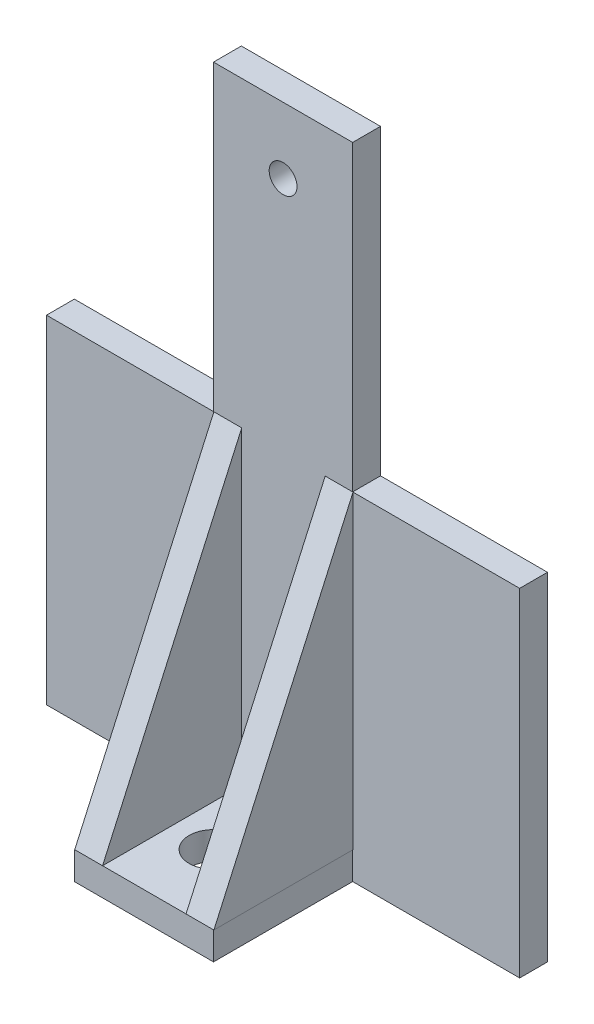
ISO-10303-21;
HEADER;
FILE_DESCRIPTION(('STEP AP214'),'2;1');
FILE_NAME('part.step','',(''),(''),'','','');
FILE_SCHEMA(('AUTOMOTIVE_DESIGN { 1 0 10303 214 1 1 1 1 }'));
ENDSEC;
DATA;
#1=APPLICATION_CONTEXT('core data for automotive mechanical design processes');
#2=APPLICATION_PROTOCOL_DEFINITION('international standard','automotive_design',2000,#1);
#3=PRODUCT_CONTEXT('',#1,'mechanical');
#4=PRODUCT('Part','Part','',(#3));
#5=PRODUCT_RELATED_PRODUCT_CATEGORY('part','',(#4));
#6=PRODUCT_DEFINITION_FORMATION('','',#4);
#7=PRODUCT_DEFINITION_CONTEXT('part definition',#1,'design');
#8=PRODUCT_DEFINITION('design','',#6,#7);
#9=PRODUCT_DEFINITION_SHAPE('','',#8);
#10=(LENGTH_UNIT() NAMED_UNIT(*) SI_UNIT(.MILLI.,.METRE.));
#11=(NAMED_UNIT(*) PLANE_ANGLE_UNIT() SI_UNIT($,.RADIAN.));
#12=(NAMED_UNIT(*) SI_UNIT($,.STERADIAN.) SOLID_ANGLE_UNIT());
#13=UNCERTAINTY_MEASURE_WITH_UNIT(LENGTH_MEASURE(1.E-05),#10,'distance_accuracy_value','');
#14=(GEOMETRIC_REPRESENTATION_CONTEXT(3) GLOBAL_UNCERTAINTY_ASSIGNED_CONTEXT((#13)) GLOBAL_UNIT_ASSIGNED_CONTEXT((#10,
#11,#12)) REPRESENTATION_CONTEXT('',''));
#15=CARTESIAN_POINT('',(0.,0.,0.));
#16=DIRECTION('',(0.,0.,1.));
#17=DIRECTION('',(1.,0.,0.));
#18=AXIS2_PLACEMENT_3D('',#15,#16,#17);
#19=CARTESIAN_POINT('',(4.60182672335277,-6.70833333333333,12.));
#20=DIRECTION('',(0.,0.409938501027306,0.912113164785755));
#21=DIRECTION('',(0.,-0.912113164785755,0.409938501027306));
#22=AXIS2_PLACEMENT_3D('',#19,#20,#21);
#23=PLANE('',#22);
#24=DIRECTION('',(0.,-0.912113164785755,0.409938501027306));
#25=VECTOR('',#24,1.);
#26=CARTESIAN_POINT('',(-3.39817327664723,-6.70833333333333,12.));
#27=LINE('',#26,#25);
#28=CARTESIAN_POINT('',(-3.39817327664723,15.5416666666667,2.));
#29=VERTEX_POINT('',#28);
#30=CARTESIAN_POINT('',(-3.39817327664723,-6.70833333333333,12.));
#31=VERTEX_POINT('',#30);
#32=EDGE_CURVE('E11',#29,#31,#27,.T.);
#33=ORIENTED_EDGE('',*,*,#32,.F.);
#34=DIRECTION('',(-1.,0.,0.));
#35=VECTOR('',#34,1.);
#36=CARTESIAN_POINT('',(4.60182672335277,15.5416666666667,2.));
#37=LINE('',#36,#35);
#38=CARTESIAN_POINT('',(-5.39817327664723,15.5416666666667,2.));
#39=VERTEX_POINT('',#38);
#40=EDGE_CURVE('E181',#29,#39,#37,.T.);
#41=ORIENTED_EDGE('',*,*,#40,.T.);
#42=DIRECTION('',(0.,0.912113164785755,-0.409938501027306));
#43=VECTOR('',#42,1.);
#44=CARTESIAN_POINT('',(-5.39817327664723,-6.70833333333333,12.));
#45=LINE('',#44,#43);
#46=CARTESIAN_POINT('',(-5.39817327664723,-6.70833333333333,12.));
#47=VERTEX_POINT('',#46);
#48=EDGE_CURVE('E198',#47,#39,#45,.T.);
#49=ORIENTED_EDGE('',*,*,#48,.F.);
#50=DIRECTION('',(-1.,0.,0.));
#51=VECTOR('',#50,1.);
#52=CARTESIAN_POINT('',(-17.425350174075,-6.70833333333333,12.));
#53=LINE('',#52,#51);
#54=EDGE_CURVE('E260',#31,#47,#53,.T.);
#55=ORIENTED_EDGE('',*,*,#54,.F.);
#56=EDGE_LOOP('',(#33,#41,#49,#55));
#57=FACE_BOUND('',#56,.T.);
#58=ADVANCED_FACE('F41',(#57),#23,.T.);
#59=CARTESIAN_POINT('',(0.,0.,2.));
#60=DIRECTION('',(0.,0.,1.));
#61=DIRECTION('',(1.,0.,0.));
#62=AXIS2_PLACEMENT_3D('',#59,#60,#61);
#63=PLANE('',#62);
#64=DIRECTION('',(-1.,0.,0.));
#65=VECTOR('',#64,1.);
#66=CARTESIAN_POINT('',(4.60182672335277,-6.70833333333333,2.));
#67=LINE('',#66,#65);
#68=CARTESIAN_POINT('',(4.60182672335277,-6.70833333333333,2.));
#69=VERTEX_POINT('',#68);
#70=CARTESIAN_POINT('',(4.57464982592503,-6.70833333333333,2.));
#71=VERTEX_POINT('',#70);
#72=EDGE_CURVE('E210',#69,#71,#67,.T.);
#73=ORIENTED_EDGE('',*,*,#72,.T.);
#74=DIRECTION('',(0.,1.,0.));
#75=VECTOR('',#74,1.);
#76=CARTESIAN_POINT('',(4.57464982592503,-16.7083333333333,2.));
#77=LINE('',#76,#75);
#78=CARTESIAN_POINT('',(4.57464982592503,-8.70833333333333,2.));
#79=VERTEX_POINT('',#78);
#80=EDGE_CURVE('E232',#79,#71,#77,.T.);
#81=ORIENTED_EDGE('',*,*,#80,.F.);
#82=DIRECTION('',(-1.,0.,0.));
#83=VECTOR('',#82,1.);
#84=CARTESIAN_POINT('',(0.,-8.70833333333333,2.));
#85=LINE('',#84,#83);
#86=CARTESIAN_POINT('',(16.574649825925,-8.70833333333333,2.));
#87=VERTEX_POINT('',#86);
#88=EDGE_CURVE('E244',#87,#79,#85,.T.);
#89=ORIENTED_EDGE('',*,*,#88,.F.);
#90=DIRECTION('',(0.,1.,0.));
#91=VECTOR('',#90,1.);
#92=CARTESIAN_POINT('',(16.574649825925,0.,2.));
#93=LINE('',#92,#91);
#94=CARTESIAN_POINT('',(16.574649825925,15.5416666666667,2.));
#95=VERTEX_POINT('',#94);
#96=EDGE_CURVE('E278',#87,#95,#93,.T.);
#97=ORIENTED_EDGE('',*,*,#96,.T.);
#98=DIRECTION('',(1.,0.,0.));
#99=VECTOR('',#98,1.);
#100=CARTESIAN_POINT('',(0.,15.5416666666667,2.));
#101=LINE('',#100,#99);
#102=CARTESIAN_POINT('',(4.60182672335277,15.5416666666667,2.));
#103=VERTEX_POINT('',#102);
#104=EDGE_CURVE('E282',#103,#95,#101,.T.);
#105=ORIENTED_EDGE('',*,*,#104,.F.);
#106=DIRECTION('',(0.,-1.,0.));
#107=VECTOR('',#106,1.);
#108=CARTESIAN_POINT('',(4.60182672335277,15.5416666666667,2.));
#109=LINE('',#108,#107);
#110=EDGE_CURVE('E201',#103,#69,#109,.T.);
#111=ORIENTED_EDGE('',*,*,#110,.T.);
#112=EDGE_LOOP('',(#73,#81,#89,#97,#105,#111));
#113=FACE_BOUND('',#112,.T.);
#114=ADVANCED_FACE('F414',(#113),#63,.T.);
#115=CARTESIAN_POINT('',(0.,15.5416666666667,2.));
#116=DIRECTION('',(0.,1.,0.));
#117=DIRECTION('',(0.,0.,1.));
#118=AXIS2_PLACEMENT_3D('',#115,#116,#117);
#119=PLANE('',#118);
#120=DIRECTION('',(1.,0.,0.));
#121=VECTOR('',#120,1.);
#122=CARTESIAN_POINT('',(0.,15.5416666666667,0.));
#123=LINE('',#122,#121);
#124=CARTESIAN_POINT('',(-17.425350174075,15.5416666666667,0.));
#125=VERTEX_POINT('',#124);
#126=CARTESIAN_POINT('',(-5.42535017407497,15.5416666666667,0.));
#127=VERTEX_POINT('',#126);
#128=EDGE_CURVE('E306',#125,#127,#123,.T.);
#129=ORIENTED_EDGE('',*,*,#128,.F.);
#130=DIRECTION('',(0.,0.,-1.));
#131=VECTOR('',#130,1.);
#132=CARTESIAN_POINT('',(-17.425350174075,15.5416666666667,2.));
#133=LINE('',#132,#131);
#134=CARTESIAN_POINT('',(-17.425350174075,15.5416666666667,2.));
#135=VERTEX_POINT('',#134);
#136=EDGE_CURVE('E357',#135,#125,#133,.T.);
#137=ORIENTED_EDGE('',*,*,#136,.F.);
#138=DIRECTION('',(1.,0.,0.));
#139=VECTOR('',#138,1.);
#140=CARTESIAN_POINT('',(0.,15.5416666666667,2.));
#141=LINE('',#140,#139);
#142=CARTESIAN_POINT('',(-5.42535017407497,15.5416666666667,2.));
#143=VERTEX_POINT('',#142);
#144=EDGE_CURVE('E270',#135,#143,#141,.T.);
#145=ORIENTED_EDGE('',*,*,#144,.T.);
#146=DIRECTION('',(0.,0.,-1.));
#147=VECTOR('',#146,1.);
#148=CARTESIAN_POINT('',(-5.42535017407497,15.5416666666667,2.));
#149=LINE('',#148,#147);
#150=EDGE_CURVE('E298',#143,#127,#149,.T.);
#151=ORIENTED_EDGE('',*,*,#150,.T.);
#152=EDGE_LOOP('',(#129,#137,#145,#151));
#153=FACE_BOUND('',#152,.T.);
#154=ADVANCED_FACE('F395',(#153),#119,.T.);
#155=CARTESIAN_POINT('',(-17.425350174075,0.,2.));
#156=DIRECTION('',(-1.,0.,0.));
#157=DIRECTION('',(0.,0.,1.));
#158=AXIS2_PLACEMENT_3D('',#155,#156,#157);
#159=PLANE('',#158);
#160=DIRECTION('',(0.,0.,-1.));
#161=VECTOR('',#160,1.);
#162=CARTESIAN_POINT('',(-17.425350174075,-8.70833333333333,2.));
#163=LINE('',#162,#161);
#164=CARTESIAN_POINT('',(-17.425350174075,-8.70833333333333,2.));
#165=VERTEX_POINT('',#164);
#166=CARTESIAN_POINT('',(-17.425350174075,-8.70833333333333,0.));
#167=VERTEX_POINT('',#166);
#168=EDGE_CURVE('E354',#165,#167,#163,.T.);
#169=ORIENTED_EDGE('',*,*,#168,.F.);
#170=DIRECTION('',(0.,1.,0.));
#171=VECTOR('',#170,1.);
#172=CARTESIAN_POINT('',(-17.425350174075,0.,2.));
#173=LINE('',#172,#171);
#174=EDGE_CURVE('E275',#165,#135,#173,.T.);
#175=ORIENTED_EDGE('',*,*,#174,.T.);
#176=ORIENTED_EDGE('',*,*,#136,.T.);
#177=DIRECTION('',(0.,1.,0.));
#178=VECTOR('',#177,1.);
#179=CARTESIAN_POINT('',(-17.425350174075,0.,0.));
#180=LINE('',#179,#178);
#181=EDGE_CURVE('E310',#167,#125,#180,.T.);
#182=ORIENTED_EDGE('',*,*,#181,.F.);
#183=EDGE_LOOP('',(#169,#175,#176,#182));
#184=FACE_BOUND('',#183,.T.);
#185=ADVANCED_FACE('F403',(#184),#159,.T.);
#186=CARTESIAN_POINT('',(0.,-8.70833333333333,2.));
#187=DIRECTION('',(0.,1.,0.));
#188=DIRECTION('',(0.,0.,1.));
#189=AXIS2_PLACEMENT_3D('',#186,#187,#188);
#190=PLANE('',#189);
#191=CARTESIAN_POINT('',(-0.425350174074971,-8.70833333333333,7.));
#192=DIRECTION('',(0.,1.,0.));
#193=DIRECTION('',(0.,0.,1.));
#194=AXIS2_PLACEMENT_3D('',#191,#192,#193);
#195=CIRCLE('',#194,1.75);
#196=CARTESIAN_POINT('',(-0.425350174074971,-8.70833333333333,8.75));
#197=VERTEX_POINT('',#196);
#198=EDGE_CURVE('E252',#197,#197,#195,.T.);
#199=ORIENTED_EDGE('',*,*,#198,.T.);
#200=EDGE_LOOP('',(#199));
#201=FACE_BOUND('',#200,.T.);
#202=DIRECTION('',(0.,0.,-1.));
#203=VECTOR('',#202,1.);
#204=CARTESIAN_POINT('',(-5.39817327664723,-8.70833333333333,2.));
#205=LINE('',#204,#203);
#206=CARTESIAN_POINT('',(-5.39817327664723,-8.70833333333333,12.));
#207=VERTEX_POINT('',#206);
#208=CARTESIAN_POINT('',(-5.39817327664723,-8.70833333333333,2.));
#209=VERTEX_POINT('',#208);
#210=EDGE_CURVE('E64',#207,#209,#205,.T.);
#211=ORIENTED_EDGE('',*,*,#210,.T.);
#212=DIRECTION('',(-1.,0.,0.));
#213=VECTOR('',#212,1.);
#214=CARTESIAN_POINT('',(0.,-8.70833333333333,2.));
#215=LINE('',#214,#213);
#216=EDGE_CURVE('E248',#209,#165,#215,.T.);
#217=ORIENTED_EDGE('',*,*,#216,.T.);
#218=ORIENTED_EDGE('',*,*,#168,.T.);
#219=DIRECTION('',(1.,0.,0.));
#220=VECTOR('',#219,1.);
#221=CARTESIAN_POINT('',(0.,-8.70833333333333,0.));
#222=LINE('',#221,#220);
#223=CARTESIAN_POINT('',(16.574649825925,-8.70833333333333,0.));
#224=VERTEX_POINT('',#223);
#225=EDGE_CURVE('E314',#167,#224,#222,.T.);
#226=ORIENTED_EDGE('',*,*,#225,.T.);
#227=DIRECTION('',(0.,0.,-1.));
#228=VECTOR('',#227,1.);
#229=CARTESIAN_POINT('',(16.574649825925,-8.70833333333333,2.));
#230=LINE('',#229,#228);
#231=EDGE_CURVE('E351',#87,#224,#230,.T.);
#232=ORIENTED_EDGE('',*,*,#231,.F.);
#233=ORIENTED_EDGE('',*,*,#88,.T.);
#234=DIRECTION('',(0.,0.,1.));
#235=VECTOR('',#234,1.);
#236=CARTESIAN_POINT('',(4.57464982592503,-8.70833333333333,2.));
#237=LINE('',#236,#235);
#238=CARTESIAN_POINT('',(4.57464982592503,-8.70833333333333,12.));
#239=VERTEX_POINT('',#238);
#240=EDGE_CURVE('E231',#79,#239,#237,.T.);
#241=ORIENTED_EDGE('',*,*,#240,.T.);
#242=DIRECTION('',(1.,0.,0.));
#243=VECTOR('',#242,1.);
#244=CARTESIAN_POINT('',(-17.425350174075,-8.70833333333333,12.));
#245=LINE('',#244,#243);
#246=EDGE_CURVE('E256',#207,#239,#245,.T.);
#247=ORIENTED_EDGE('',*,*,#246,.F.);
#248=EDGE_LOOP('',(#211,#217,#218,#226,#232,#233,#241,#247));
#249=FACE_BOUND('',#248,.T.);
#250=ADVANCED_FACE('F399',(#201,#249),#190,.F.);
#251=CARTESIAN_POINT('',(16.574649825925,0.,2.));
#252=DIRECTION('',(-1.,0.,0.));
#253=DIRECTION('',(0.,0.,1.));
#254=AXIS2_PLACEMENT_3D('',#251,#252,#253);
#255=PLANE('',#254);
#256=ORIENTED_EDGE('',*,*,#96,.F.);
#257=ORIENTED_EDGE('',*,*,#231,.T.);
#258=DIRECTION('',(0.,1.,0.));
#259=VECTOR('',#258,1.);
#260=CARTESIAN_POINT('',(16.574649825925,0.,0.));
#261=LINE('',#260,#259);
#262=CARTESIAN_POINT('',(16.574649825925,15.5416666666667,0.));
#263=VERTEX_POINT('',#262);
#264=EDGE_CURVE('E318',#224,#263,#261,.T.);
#265=ORIENTED_EDGE('',*,*,#264,.T.);
#266=DIRECTION('',(0.,0.,-1.));
#267=VECTOR('',#266,1.);
#268=CARTESIAN_POINT('',(16.574649825925,15.5416666666667,2.));
#269=LINE('',#268,#267);
#270=EDGE_CURVE('E348',#95,#263,#269,.T.);
#271=ORIENTED_EDGE('',*,*,#270,.F.);
#272=EDGE_LOOP('',(#256,#257,#265,#271));
#273=FACE_BOUND('',#272,.T.);
#274=ADVANCED_FACE('F410',(#273),#255,.F.);
#275=CARTESIAN_POINT('',(0.,15.5416666666667,2.));
#276=DIRECTION('',(0.,1.,0.));
#277=DIRECTION('',(0.,0.,1.));
#278=AXIS2_PLACEMENT_3D('',#275,#276,#277);
#279=PLANE('',#278);
#280=DIRECTION('',(1.,0.,0.));
#281=VECTOR('',#280,1.);
#282=CARTESIAN_POINT('',(0.,15.5416666666667,0.));
#283=LINE('',#282,#281);
#284=CARTESIAN_POINT('',(4.57464982592503,15.5416666666667,0.));
#285=VERTEX_POINT('',#284);
#286=EDGE_CURVE('E322',#285,#263,#283,.T.);
#287=ORIENTED_EDGE('',*,*,#286,.F.);
#288=DIRECTION('',(0.,0.,-1.));
#289=VECTOR('',#288,1.);
#290=CARTESIAN_POINT('',(4.57464982592503,15.5416666666667,2.));
#291=LINE('',#290,#289);
#292=CARTESIAN_POINT('',(4.57464982592503,15.5416666666667,2.));
#293=VERTEX_POINT('',#292);
#294=EDGE_CURVE('E345',#293,#285,#291,.T.);
#295=ORIENTED_EDGE('',*,*,#294,.F.);
#296=EDGE_CURVE('E283',#293,#103,#101,.T.);
#297=ORIENTED_EDGE('',*,*,#296,.T.);
#298=ORIENTED_EDGE('',*,*,#104,.T.);
#299=ORIENTED_EDGE('',*,*,#270,.T.);
#300=EDGE_LOOP('',(#287,#295,#297,#298,#299));
#301=FACE_BOUND('',#300,.T.);
#302=ADVANCED_FACE('F377',(#301),#279,.T.);
#303=CARTESIAN_POINT('',(4.57464982592503,0.,2.));
#304=DIRECTION('',(-1.,0.,0.));
#305=DIRECTION('',(0.,0.,1.));
#306=AXIS2_PLACEMENT_3D('',#303,#304,#305);
#307=PLANE('',#306);
#308=DIRECTION('',(0.,1.,0.));
#309=VECTOR('',#308,1.);
#310=CARTESIAN_POINT('',(4.57464982592503,0.,0.));
#311=LINE('',#310,#309);
#312=CARTESIAN_POINT('',(4.57464982592503,37.2916666666667,0.));
#313=VERTEX_POINT('',#312);
#314=EDGE_CURVE('E326',#285,#313,#311,.T.);
#315=ORIENTED_EDGE('',*,*,#314,.T.);
#316=DIRECTION('',(0.,0.,-1.));
#317=VECTOR('',#316,1.);
#318=CARTESIAN_POINT('',(4.57464982592503,37.2916666666667,2.));
#319=LINE('',#318,#317);
#320=CARTESIAN_POINT('',(4.57464982592503,37.2916666666667,2.));
#321=VERTEX_POINT('',#320);
#322=EDGE_CURVE('E342',#321,#313,#319,.T.);
#323=ORIENTED_EDGE('',*,*,#322,.F.);
#324=DIRECTION('',(0.,1.,0.));
#325=VECTOR('',#324,1.);
#326=CARTESIAN_POINT('',(4.57464982592503,0.,2.));
#327=LINE('',#326,#325);
#328=EDGE_CURVE('E287',#293,#321,#327,.T.);
#329=ORIENTED_EDGE('',*,*,#328,.F.);
#330=ORIENTED_EDGE('',*,*,#294,.T.);
#331=EDGE_LOOP('',(#315,#323,#329,#330));
#332=FACE_BOUND('',#331,.T.);
#333=ADVANCED_FACE('F383',(#332),#307,.F.);
#334=CARTESIAN_POINT('',(0.,37.2916666666667,2.));
#335=DIRECTION('',(0.,1.,0.));
#336=DIRECTION('',(0.,0.,1.));
#337=AXIS2_PLACEMENT_3D('',#334,#335,#336);
#338=PLANE('',#337);
#339=DIRECTION('',(1.,0.,0.));
#340=VECTOR('',#339,1.);
#341=CARTESIAN_POINT('',(0.,37.2916666666667,0.));
#342=LINE('',#341,#340);
#343=CARTESIAN_POINT('',(-5.42535017407497,37.2916666666667,0.));
#344=VERTEX_POINT('',#343);
#345=EDGE_CURVE('E330',#344,#313,#342,.T.);
#346=ORIENTED_EDGE('',*,*,#345,.F.);
#347=DIRECTION('',(0.,0.,-1.));
#348=VECTOR('',#347,1.);
#349=CARTESIAN_POINT('',(-5.42535017407497,37.2916666666667,2.));
#350=LINE('',#349,#348);
#351=CARTESIAN_POINT('',(-5.42535017407497,37.2916666666667,2.));
#352=VERTEX_POINT('',#351);
#353=EDGE_CURVE('E339',#352,#344,#350,.T.);
#354=ORIENTED_EDGE('',*,*,#353,.F.);
#355=DIRECTION('',(1.,0.,0.));
#356=VECTOR('',#355,1.);
#357=CARTESIAN_POINT('',(0.,37.2916666666667,2.));
#358=LINE('',#357,#356);
#359=EDGE_CURVE('E290',#352,#321,#358,.T.);
#360=ORIENTED_EDGE('',*,*,#359,.T.);
#361=ORIENTED_EDGE('',*,*,#322,.T.);
#362=EDGE_LOOP('',(#346,#354,#360,#361));
#363=FACE_BOUND('',#362,.T.);
#364=ADVANCED_FACE('F464',(#363),#338,.T.);
#365=CARTESIAN_POINT('',(-0.425350174074971,-3.95833333333333,2.));
#366=DIRECTION('',(0.,0.,-1.));
#367=DIRECTION('',(-1.,0.,0.));
#368=AXIS2_PLACEMENT_3D('',#365,#366,#367);
#369=CYLINDRICAL_SURFACE('',#368,1.);
#370=CARTESIAN_POINT('',(-0.425350174074971,-3.95833333333333,2.));
#371=DIRECTION('',(0.,0.,-1.));
#372=DIRECTION('',(-1.,0.,0.));
#373=AXIS2_PLACEMENT_3D('',#370,#371,#372);
#374=CIRCLE('',#373,1.);
#375=CARTESIAN_POINT('',(-1.42535017407497,-3.95833333333333,2.));
#376=VERTEX_POINT('',#375);
#377=EDGE_CURVE('E191',#376,#376,#374,.T.);
#378=ORIENTED_EDGE('',*,*,#377,.F.);
#379=EDGE_LOOP('',(#378));
#380=FACE_BOUND('',#379,.T.);
#381=CARTESIAN_POINT('',(-0.425350174074971,-3.95833333333333,0.));
#382=DIRECTION('',(0.,0.,1.));
#383=DIRECTION('',(1.,0.,0.));
#384=AXIS2_PLACEMENT_3D('',#381,#382,#383);
#385=CIRCLE('',#384,1.);
#386=CARTESIAN_POINT('',(0.574649825925029,-3.95833333333333,0.));
#387=VERTEX_POINT('',#386);
#388=EDGE_CURVE('E302',#387,#387,#385,.T.);
#389=ORIENTED_EDGE('',*,*,#388,.F.);
#390=EDGE_LOOP('',(#389));
#391=FACE_BOUND('',#390,.T.);
#392=ADVANCED_FACE('F467',(#380,#391),#369,.F.);
#393=CARTESIAN_POINT('',(-0.425350174074971,32.5416666666667,2.));
#394=DIRECTION('',(0.,0.,-1.));
#395=DIRECTION('',(-1.,0.,0.));
#396=AXIS2_PLACEMENT_3D('',#393,#394,#395);
#397=CYLINDRICAL_SURFACE('',#396,1.);
#398=CARTESIAN_POINT('',(-0.425350174074971,32.5416666666667,2.));
#399=DIRECTION('',(0.,0.,1.));
#400=DIRECTION('',(1.,0.,0.));
#401=AXIS2_PLACEMENT_3D('',#398,#399,#400);
#402=CIRCLE('',#401,1.);
#403=CARTESIAN_POINT('',(0.574649825925029,32.5416666666667,2.));
#404=VERTEX_POINT('',#403);
#405=EDGE_CURVE('E266',#404,#404,#402,.T.);
#406=ORIENTED_EDGE('',*,*,#405,.T.);
#407=EDGE_LOOP('',(#406));
#408=FACE_BOUND('',#407,.T.);
#409=CARTESIAN_POINT('',(-0.425350174074971,32.5416666666667,0.));
#410=DIRECTION('',(0.,0.,1.));
#411=DIRECTION('',(1.,0.,0.));
#412=AXIS2_PLACEMENT_3D('',#409,#410,#411);
#413=CIRCLE('',#412,1.);
#414=CARTESIAN_POINT('',(0.574649825925029,32.5416666666667,0.));
#415=VERTEX_POINT('',#414);
#416=EDGE_CURVE('E265',#415,#415,#413,.T.);
#417=ORIENTED_EDGE('',*,*,#416,.F.);
#418=EDGE_LOOP('',(#417));
#419=FACE_BOUND('',#418,.T.);
#420=ADVANCED_FACE('F43',(#408,#419),#397,.F.);
#421=CARTESIAN_POINT('',(-5.42535017407497,0.,2.));
#422=DIRECTION('',(-1.,0.,0.));
#423=DIRECTION('',(0.,-1.,0.));
#424=AXIS2_PLACEMENT_3D('',#421,#422,#423);
#425=PLANE('',#424);
#426=DIRECTION('',(0.,1.,0.));
#427=VECTOR('',#426,1.);
#428=CARTESIAN_POINT('',(-5.42535017407497,0.,0.));
#429=LINE('',#428,#427);
#430=EDGE_CURVE('E271',#127,#344,#429,.T.);
#431=ORIENTED_EDGE('',*,*,#430,.F.);
#432=ORIENTED_EDGE('',*,*,#150,.F.);
#433=DIRECTION('',(0.,1.,0.));
#434=VECTOR('',#433,1.);
#435=CARTESIAN_POINT('',(-5.42535017407497,0.,2.));
#436=LINE('',#435,#434);
#437=EDGE_CURVE('E294',#143,#352,#436,.T.);
#438=ORIENTED_EDGE('',*,*,#437,.T.);
#439=ORIENTED_EDGE('',*,*,#353,.T.);
#440=EDGE_LOOP('',(#431,#432,#438,#439));
#441=FACE_BOUND('',#440,.T.);
#442=ADVANCED_FACE('F390',(#441),#425,.T.);
#443=CARTESIAN_POINT('',(2.60182672335277,15.5416666666667,2.));
#444=VERTEX_POINT('',#443);
#445=EDGE_CURVE('E215',#293,#444,#37,.T.);
#446=ORIENTED_EDGE('',*,*,#445,.F.);
#447=ORIENTED_EDGE('',*,*,#328,.T.);
#448=ORIENTED_EDGE('',*,*,#359,.F.);
#449=ORIENTED_EDGE('',*,*,#437,.F.);
#450=ORIENTED_EDGE('',*,*,#144,.F.);
#451=ORIENTED_EDGE('',*,*,#174,.F.);
#452=ORIENTED_EDGE('',*,*,#216,.F.);
#453=DIRECTION('',(0.,1.,0.));
#454=VECTOR('',#453,1.);
#455=CARTESIAN_POINT('',(-5.39817327664723,-16.7083333333333,2.));
#456=LINE('',#455,#454);
#457=EDGE_CURVE('E228',#209,#39,#456,.T.);
#458=ORIENTED_EDGE('',*,*,#457,.T.);
#459=ORIENTED_EDGE('',*,*,#40,.F.);
#460=DIRECTION('',(0.,-1.,0.));
#461=VECTOR('',#460,1.);
#462=CARTESIAN_POINT('',(-3.39817327664723,-6.70833333333333,2.));
#463=LINE('',#462,#461);
#464=CARTESIAN_POINT('',(-3.39817327664723,-6.70833333333333,2.));
#465=VERTEX_POINT('',#464);
#466=EDGE_CURVE('E160',#29,#465,#463,.T.);
#467=ORIENTED_EDGE('',*,*,#466,.T.);
#468=DIRECTION('',(1.,0.,0.));
#469=VECTOR('',#468,1.);
#470=CARTESIAN_POINT('',(-3.39817327664723,-6.70833333333333,2.));
#471=LINE('',#470,#469);
#472=CARTESIAN_POINT('',(2.60182672335277,-6.70833333333333,2.));
#473=VERTEX_POINT('',#472);
#474=EDGE_CURVE('E168',#465,#473,#471,.T.);
#475=ORIENTED_EDGE('',*,*,#474,.T.);
#476=DIRECTION('',(0.,1.,0.));
#477=VECTOR('',#476,1.);
#478=CARTESIAN_POINT('',(2.60182672335277,-6.70833333333333,2.));
#479=LINE('',#478,#477);
#480=EDGE_CURVE('E165',#473,#444,#479,.T.);
#481=ORIENTED_EDGE('',*,*,#480,.T.);
#482=EDGE_LOOP('',(#446,#447,#448,#449,#450,#451,#452,#458,#459,#467,#475,#481));
#483=FACE_BOUND('',#482,.T.);
#484=ORIENTED_EDGE('',*,*,#405,.F.);
#485=EDGE_LOOP('',(#484));
#486=FACE_BOUND('',#485,.T.);
#487=ORIENTED_EDGE('',*,*,#377,.T.);
#488=EDGE_LOOP('',(#487));
#489=FACE_BOUND('',#488,.T.);
#490=ADVANCED_FACE('F178',(#483,#486,#489),#63,.T.);
#491=CARTESIAN_POINT('',(0.,0.,0.));
#492=DIRECTION('',(0.,0.,1.));
#493=DIRECTION('',(1.,0.,0.));
#494=AXIS2_PLACEMENT_3D('',#491,#492,#493);
#495=PLANE('',#494);
#496=ORIENTED_EDGE('',*,*,#416,.T.);
#497=EDGE_LOOP('',(#496));
#498=FACE_BOUND('',#497,.T.);
#499=ORIENTED_EDGE('',*,*,#388,.T.);
#500=EDGE_LOOP('',(#499));
#501=FACE_BOUND('',#500,.T.);
#502=ORIENTED_EDGE('',*,*,#128,.T.);
#503=ORIENTED_EDGE('',*,*,#430,.T.);
#504=ORIENTED_EDGE('',*,*,#345,.T.);
#505=ORIENTED_EDGE('',*,*,#314,.F.);
#506=ORIENTED_EDGE('',*,*,#286,.T.);
#507=ORIENTED_EDGE('',*,*,#264,.F.);
#508=ORIENTED_EDGE('',*,*,#225,.F.);
#509=ORIENTED_EDGE('',*,*,#181,.T.);
#510=EDGE_LOOP('',(#502,#503,#504,#505,#506,#507,#508,#509));
#511=FACE_BOUND('',#510,.T.);
#512=ADVANCED_FACE('F405',(#498,#501,#511),#495,.F.);
#513=CARTESIAN_POINT('',(0.,0.,12.));
#514=DIRECTION('',(0.,0.,-1.));
#515=DIRECTION('',(-1.,0.,0.));
#516=AXIS2_PLACEMENT_3D('',#513,#514,#515);
#517=PLANE('',#516);
#518=CARTESIAN_POINT('',(4.57464982592503,-6.70833333333333,12.));
#519=VERTEX_POINT('',#518);
#520=CARTESIAN_POINT('',(2.60182672335277,-6.70833333333333,12.));
#521=VERTEX_POINT('',#520);
#522=EDGE_CURVE('E261',#519,#521,#53,.T.);
#523=ORIENTED_EDGE('',*,*,#522,.T.);
#524=DIRECTION('',(1.,0.,0.));
#525=VECTOR('',#524,1.);
#526=CARTESIAN_POINT('',(-3.39817327664723,-6.70833333333333,12.));
#527=LINE('',#526,#525);
#528=EDGE_CURVE('E183',#31,#521,#527,.T.);
#529=ORIENTED_EDGE('',*,*,#528,.F.);
#530=ORIENTED_EDGE('',*,*,#54,.T.);
#531=DIRECTION('',(0.,-1.,0.));
#532=VECTOR('',#531,1.);
#533=CARTESIAN_POINT('',(-5.39817327664723,0.,12.));
#534=LINE('',#533,#532);
#535=EDGE_CURVE('E364',#47,#207,#534,.T.);
#536=ORIENTED_EDGE('',*,*,#535,.T.);
#537=ORIENTED_EDGE('',*,*,#246,.T.);
#538=DIRECTION('',(0.,1.,0.));
#539=VECTOR('',#538,1.);
#540=CARTESIAN_POINT('',(4.57464982592503,0.,12.));
#541=LINE('',#540,#539);
#542=EDGE_CURVE('E360',#239,#519,#541,.T.);
#543=ORIENTED_EDGE('',*,*,#542,.T.);
#544=EDGE_LOOP('',(#523,#529,#530,#536,#537,#543));
#545=FACE_BOUND('',#544,.T.);
#546=ADVANCED_FACE('F418',(#545),#517,.F.);
#547=CARTESIAN_POINT('',(-0.425350174074971,-16.7083333333333,7.));
#548=DIRECTION('',(0.,1.,0.));
#549=DIRECTION('',(0.,0.,1.));
#550=AXIS2_PLACEMENT_3D('',#547,#548,#549);
#551=CYLINDRICAL_SURFACE('',#550,1.75);
#552=CARTESIAN_POINT('',(-0.425350174074971,-6.70833333333333,7.));
#553=DIRECTION('',(0.,-1.,0.));
#554=DIRECTION('',(0.,0.,-1.));
#555=AXIS2_PLACEMENT_3D('',#552,#553,#554);
#556=CIRCLE('',#555,1.75);
#557=CARTESIAN_POINT('',(-0.425350174074971,-6.70833333333333,5.25));
#558=VERTEX_POINT('',#557);
#559=EDGE_CURVE('E209',#558,#558,#556,.F.);
#560=ORIENTED_EDGE('',*,*,#559,.T.);
#561=EDGE_LOOP('',(#560));
#562=FACE_BOUND('',#561,.T.);
#563=ORIENTED_EDGE('',*,*,#198,.F.);
#564=EDGE_LOOP('',(#563));
#565=FACE_BOUND('',#564,.T.);
#566=ADVANCED_FACE('F452',(#562,#565),#551,.F.);
#567=CARTESIAN_POINT('',(4.57464982592503,-16.7083333333333,12.));
#568=DIRECTION('',(-1.,0.,0.));
#569=DIRECTION('',(0.,0.,1.));
#570=AXIS2_PLACEMENT_3D('',#567,#568,#569);
#571=PLANE('',#570);
#572=ORIENTED_EDGE('',*,*,#80,.T.);
#573=DIRECTION('',(0.,0.,1.));
#574=VECTOR('',#573,1.);
#575=CARTESIAN_POINT('',(4.57464982592503,-6.70833333333333,12.));
#576=LINE('',#575,#574);
#577=EDGE_CURVE('E214',#71,#519,#576,.T.);
#578=ORIENTED_EDGE('',*,*,#577,.T.);
#579=ORIENTED_EDGE('',*,*,#542,.F.);
#580=ORIENTED_EDGE('',*,*,#240,.F.);
#581=EDGE_LOOP('',(#572,#578,#579,#580));
#582=FACE_BOUND('',#581,.T.);
#583=ADVANCED_FACE('F416',(#582),#571,.F.);
#584=CARTESIAN_POINT('',(-5.39817327664723,-16.7083333333333,12.));
#585=DIRECTION('',(1.,0.,0.));
#586=DIRECTION('',(0.,0.,-1.));
#587=AXIS2_PLACEMENT_3D('',#584,#585,#586);
#588=PLANE('',#587);
#589=ORIENTED_EDGE('',*,*,#535,.F.);
#590=ORIENTED_EDGE('',*,*,#48,.T.);
#591=ORIENTED_EDGE('',*,*,#457,.F.);
#592=ORIENTED_EDGE('',*,*,#210,.F.);
#593=EDGE_LOOP('',(#589,#590,#591,#592));
#594=FACE_BOUND('',#593,.T.);
#595=ADVANCED_FACE('F421',(#594),#588,.F.);
#596=CARTESIAN_POINT('',(4.60182672335277,-6.70833333333333,2.));
#597=DIRECTION('',(0.,-1.,0.));
#598=DIRECTION('',(0.,0.,-1.));
#599=AXIS2_PLACEMENT_3D('',#596,#597,#598);
#600=PLANE('',#599);
#601=ORIENTED_EDGE('',*,*,#577,.F.);
#602=ORIENTED_EDGE('',*,*,#72,.F.);
#603=DIRECTION('',(0.,0.,1.));
#604=VECTOR('',#603,1.);
#605=CARTESIAN_POINT('',(4.60182672335277,-6.70833333333333,2.));
#606=LINE('',#605,#604);
#607=CARTESIAN_POINT('',(4.60182672335277,-6.70833333333333,12.));
#608=VERTEX_POINT('',#607);
#609=EDGE_CURVE('E193',#69,#608,#606,.T.);
#610=ORIENTED_EDGE('',*,*,#609,.T.);
#611=DIRECTION('',(-1.,0.,0.));
#612=VECTOR('',#611,1.);
#613=CARTESIAN_POINT('',(4.60182672335277,-6.70833333333333,12.));
#614=LINE('',#613,#612);
#615=EDGE_CURVE('E205',#608,#519,#614,.T.);
#616=ORIENTED_EDGE('',*,*,#615,.T.);
#617=EDGE_LOOP('',(#601,#602,#610,#616));
#618=FACE_BOUND('',#617,.T.);
#619=ADVANCED_FACE('F427',(#618),#600,.T.);
#620=DIRECTION('',(0.,0.912113164785755,-0.409938501027306));
#621=VECTOR('',#620,1.);
#622=CARTESIAN_POINT('',(2.60182672335277,-6.70833333333333,12.));
#623=LINE('',#622,#621);
#624=EDGE_CURVE('E50',#521,#444,#623,.T.);
#625=ORIENTED_EDGE('',*,*,#624,.F.);
#626=ORIENTED_EDGE('',*,*,#522,.F.);
#627=ORIENTED_EDGE('',*,*,#615,.F.);
#628=DIRECTION('',(0.,0.912113164785755,-0.409938501027306));
#629=VECTOR('',#628,1.);
#630=CARTESIAN_POINT('',(4.60182672335277,-6.70833333333333,12.));
#631=LINE('',#630,#629);
#632=EDGE_CURVE('E197',#608,#103,#631,.T.);
#633=ORIENTED_EDGE('',*,*,#632,.T.);
#634=ORIENTED_EDGE('',*,*,#296,.F.);
#635=ORIENTED_EDGE('',*,*,#445,.T.);
#636=EDGE_LOOP('',(#625,#626,#627,#633,#634,#635));
#637=FACE_BOUND('',#636,.T.);
#638=ADVANCED_FACE('F372',(#637),#23,.T.);
#639=CARTESIAN_POINT('',(4.60182672335277,0.,0.));
#640=DIRECTION('',(1.,0.,0.));
#641=DIRECTION('',(0.,0.,-1.));
#642=AXIS2_PLACEMENT_3D('',#639,#640,#641);
#643=PLANE('',#642);
#644=ORIENTED_EDGE('',*,*,#609,.F.);
#645=ORIENTED_EDGE('',*,*,#110,.F.);
#646=ORIENTED_EDGE('',*,*,#632,.F.);
#647=EDGE_LOOP('',(#644,#645,#646));
#648=FACE_BOUND('',#647,.T.);
#649=ADVANCED_FACE('F430',(#648),#643,.T.);
#650=CARTESIAN_POINT('',(-3.39817327664723,-6.70833333333333,2.));
#651=DIRECTION('',(0.,-1.,0.));
#652=DIRECTION('',(0.,0.,-1.));
#653=AXIS2_PLACEMENT_3D('',#650,#651,#652);
#654=PLANE('',#653);
#655=ORIENTED_EDGE('',*,*,#528,.T.);
#656=DIRECTION('',(0.,0.,1.));
#657=VECTOR('',#656,1.);
#658=CARTESIAN_POINT('',(2.60182672335277,-6.70833333333333,2.));
#659=LINE('',#658,#657);
#660=EDGE_CURVE('E164',#473,#521,#659,.T.);
#661=ORIENTED_EDGE('',*,*,#660,.F.);
#662=ORIENTED_EDGE('',*,*,#474,.F.);
#663=DIRECTION('',(0.,0.,1.));
#664=VECTOR('',#663,1.);
#665=CARTESIAN_POINT('',(-3.39817327664723,-6.70833333333333,2.));
#666=LINE('',#665,#664);
#667=EDGE_CURVE('E57',#465,#31,#666,.T.);
#668=ORIENTED_EDGE('',*,*,#667,.T.);
#669=EDGE_LOOP('',(#655,#661,#662,#668));
#670=FACE_BOUND('',#669,.T.);
#671=ORIENTED_EDGE('',*,*,#559,.F.);
#672=EDGE_LOOP('',(#671));
#673=FACE_BOUND('',#672,.T.);
#674=ADVANCED_FACE('F169',(#670,#673),#654,.F.);
#675=CARTESIAN_POINT('',(-3.39817327664723,-6.70833333333333,2.));
#676=DIRECTION('',(-1.,0.,0.));
#677=DIRECTION('',(0.,0.,1.));
#678=AXIS2_PLACEMENT_3D('',#675,#676,#677);
#679=PLANE('',#678);
#680=ORIENTED_EDGE('',*,*,#32,.T.);
#681=ORIENTED_EDGE('',*,*,#667,.F.);
#682=ORIENTED_EDGE('',*,*,#466,.F.);
#683=EDGE_LOOP('',(#680,#681,#682));
#684=FACE_BOUND('',#683,.T.);
#685=ADVANCED_FACE('F158',(#684),#679,.F.);
#686=CARTESIAN_POINT('',(2.60182672335277,-6.70833333333333,2.));
#687=DIRECTION('',(1.,0.,0.));
#688=DIRECTION('',(0.,0.,-1.));
#689=AXIS2_PLACEMENT_3D('',#686,#687,#688);
#690=PLANE('',#689);
#691=ORIENTED_EDGE('',*,*,#624,.T.);
#692=ORIENTED_EDGE('',*,*,#480,.F.);
#693=ORIENTED_EDGE('',*,*,#660,.T.);
#694=EDGE_LOOP('',(#691,#692,#693));
#695=FACE_BOUND('',#694,.T.);
#696=ADVANCED_FACE('F369',(#695),#690,.F.);
#697=CLOSED_SHELL('',(#58,#114,#154,#185,#250,#274,#302,#333,#364,#392,#420,#442,#490,#512,#546,
#566,#583,#595,#619,#638,#649,#674,#685,#696));
#698=MANIFOLD_SOLID_BREP('B2',#697);
#699=ADVANCED_BREP_SHAPE_REPRESENTATION('',(#18,#698),#14);
#700=SHAPE_DEFINITION_REPRESENTATION(#9,#699);
ENDSEC;
END-ISO-10303-21;
